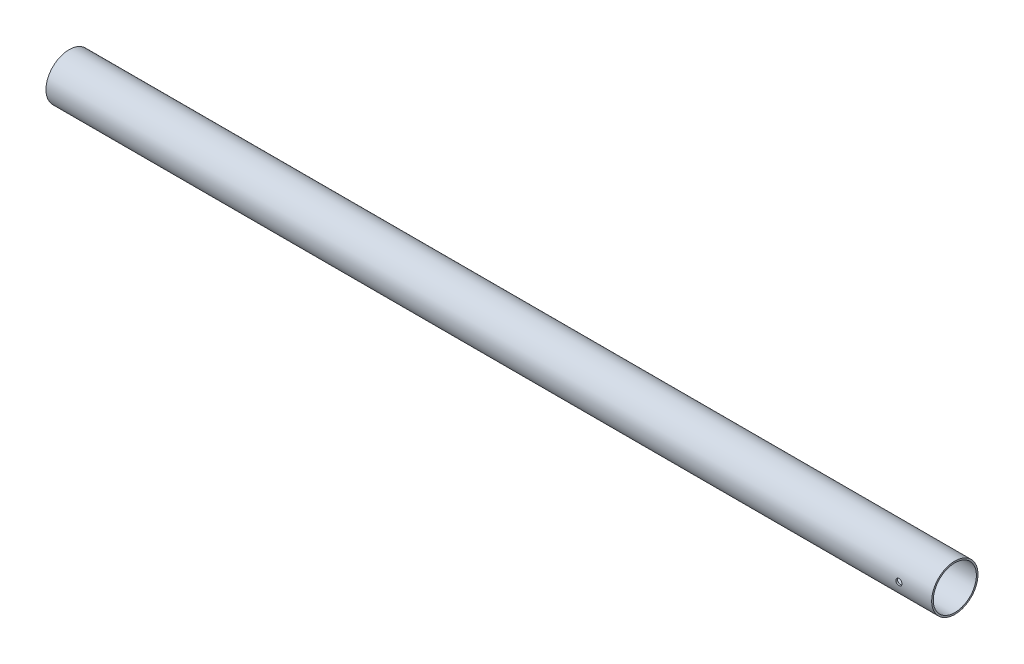
ISO-10303-21;
HEADER;
FILE_DESCRIPTION(('STEP AP214'),'2;1');
FILE_NAME('part.step','',(''),(''),'','','');
FILE_SCHEMA(('AUTOMOTIVE_DESIGN { 1 0 10303 214 1 1 1 1 }'));
ENDSEC;
DATA;
#1=APPLICATION_CONTEXT('core data for automotive mechanical design processes');
#2=APPLICATION_PROTOCOL_DEFINITION('international standard','automotive_design',2000,#1);
#3=PRODUCT_CONTEXT('',#1,'mechanical');
#4=PRODUCT('Part','Part','',(#3));
#5=PRODUCT_RELATED_PRODUCT_CATEGORY('part','',(#4));
#6=PRODUCT_DEFINITION_FORMATION('','',#4);
#7=PRODUCT_DEFINITION_CONTEXT('part definition',#1,'design');
#8=PRODUCT_DEFINITION('design','',#6,#7);
#9=PRODUCT_DEFINITION_SHAPE('','',#8);
#10=(LENGTH_UNIT() NAMED_UNIT(*) SI_UNIT(.MILLI.,.METRE.));
#11=(NAMED_UNIT(*) PLANE_ANGLE_UNIT() SI_UNIT($,.RADIAN.));
#12=(NAMED_UNIT(*) SI_UNIT($,.STERADIAN.) SOLID_ANGLE_UNIT());
#13=UNCERTAINTY_MEASURE_WITH_UNIT(LENGTH_MEASURE(1.E-05),#10,'distance_accuracy_value','');
#14=(GEOMETRIC_REPRESENTATION_CONTEXT(3) GLOBAL_UNCERTAINTY_ASSIGNED_CONTEXT((#13)) GLOBAL_UNIT_ASSIGNED_CONTEXT((#10,
#11,#12)) REPRESENTATION_CONTEXT('',''));
#15=CARTESIAN_POINT('',(0.,0.,0.));
#16=DIRECTION('',(0.,0.,1.));
#17=DIRECTION('',(1.,0.,0.));
#18=AXIS2_PLACEMENT_3D('',#15,#16,#17);
#19=CARTESIAN_POINT('',(485.9,0.,0.));
#20=DIRECTION('',(1.,0.,0.));
#21=DIRECTION('',(0.,0.,-1.));
#22=AXIS2_PLACEMENT_3D('',#19,#20,#21);
#23=PLANE('',#22);
#24=CARTESIAN_POINT('',(485.9,0.,0.));
#25=DIRECTION('',(1.,0.,0.));
#26=DIRECTION('',(0.,0.,-1.));
#27=AXIS2_PLACEMENT_3D('',#24,#25,#26);
#28=CIRCLE('',#27,12.7);
#29=CARTESIAN_POINT('',(485.9,0.,-12.7));
#30=VERTEX_POINT('',#29);
#31=EDGE_CURVE('E10',#30,#30,#28,.T.);
#32=ORIENTED_EDGE('',*,*,#31,.T.);
#33=EDGE_LOOP('',(#32));
#34=FACE_BOUND('',#33,.T.);
#35=CARTESIAN_POINT('',(485.9,0.,0.));
#36=DIRECTION('',(1.,0.,0.));
#37=DIRECTION('',(0.,0.,-1.));
#38=AXIS2_PLACEMENT_3D('',#35,#36,#37);
#39=CIRCLE('',#38,11.811);
#40=CARTESIAN_POINT('',(485.9,0.,-11.811));
#41=VERTEX_POINT('',#40);
#42=EDGE_CURVE('E56',#41,#41,#39,.T.);
#43=ORIENTED_EDGE('',*,*,#42,.F.);
#44=EDGE_LOOP('',(#43));
#45=FACE_BOUND('',#44,.T.);
#46=ADVANCED_FACE('F37',(#34,#45),#23,.T.);
#47=CARTESIAN_POINT('',(0.,0.,0.));
#48=DIRECTION('',(1.,0.,0.));
#49=DIRECTION('',(0.,0.,-1.));
#50=AXIS2_PLACEMENT_3D('',#47,#48,#49);
#51=PLANE('',#50);
#52=CARTESIAN_POINT('',(0.,0.,0.));
#53=DIRECTION('',(1.,0.,0.));
#54=DIRECTION('',(0.,0.,-1.));
#55=AXIS2_PLACEMENT_3D('',#52,#53,#54);
#56=CIRCLE('',#55,12.7);
#57=CARTESIAN_POINT('',(0.,0.,-12.7));
#58=VERTEX_POINT('',#57);
#59=EDGE_CURVE('E51',#58,#58,#56,.T.);
#60=ORIENTED_EDGE('',*,*,#59,.F.);
#61=EDGE_LOOP('',(#60));
#62=FACE_BOUND('',#61,.T.);
#63=CARTESIAN_POINT('',(0.,0.,0.));
#64=DIRECTION('',(1.,0.,0.));
#65=DIRECTION('',(0.,0.,-1.));
#66=AXIS2_PLACEMENT_3D('',#63,#64,#65);
#67=CIRCLE('',#66,11.811);
#68=CARTESIAN_POINT('',(0.,0.,-11.811));
#69=VERTEX_POINT('',#68);
#70=EDGE_CURVE('E59',#69,#69,#67,.T.);
#71=ORIENTED_EDGE('',*,*,#70,.T.);
#72=EDGE_LOOP('',(#71));
#73=FACE_BOUND('',#72,.T.);
#74=ADVANCED_FACE('F95',(#62,#73),#51,.F.);
#75=CARTESIAN_POINT('',(485.9,0.,0.));
#76=DIRECTION('',(-1.,0.,0.));
#77=DIRECTION('',(0.,0.,1.));
#78=AXIS2_PLACEMENT_3D('',#75,#76,#77);
#79=CYLINDRICAL_SURFACE('',#78,12.7);
#80=CARTESIAN_POINT('',(469.6,0.,-12.7));
#81=CARTESIAN_POINT('',(469.599995999218,0.0950339668840688,-12.6999985995786));
#82=CARTESIAN_POINT('',(469.592004188255,0.190125906931177,-12.69892205577));
#83=CARTESIAN_POINT('',(469.560251692804,0.37765973551567,-12.6947310786922));
#84=CARTESIAN_POINT('',(469.536474913755,0.470098818704444,-12.6916145654891));
#85=CARTESIAN_POINT('',(469.473868960347,0.649585162895946,-12.6836944529743));
#86=CARTESIAN_POINT('',(469.435050336211,0.736636153540434,-12.6788920363625));
#87=CARTESIAN_POINT('',(469.343486628217,0.902972809326968,-12.668133083874));
#88=CARTESIAN_POINT('',(469.290743780409,0.982259718480784,-12.6621767333452));
#89=CARTESIAN_POINT('',(469.172475253805,1.1313307462382,-12.6497322350832));
#90=CARTESIAN_POINT('',(469.106879547119,1.20105907920497,-12.6432412923369));
#91=CARTESIAN_POINT('',(468.964917838176,1.32855287527096,-12.6304814917944));
#92=CARTESIAN_POINT('',(468.888551264791,1.38631770360165,-12.6242126457971));
#93=CARTESIAN_POINT('',(468.726848730155,1.48845585085958,-12.6125794864754));
#94=CARTESIAN_POINT('',(468.641479096526,1.53277630674077,-12.6072187794791));
#95=CARTESIAN_POINT('',(468.464424454548,1.60642994888795,-12.5980462279763));
#96=CARTESIAN_POINT('',(468.372739720477,1.6357637855904,-12.5942343162519));
#97=CARTESIAN_POINT('',(468.186239299322,1.67844067068206,-12.5886179602665));
#98=CARTESIAN_POINT('',(468.09144564102,1.69187839487357,-12.5868016351371));
#99=CARTESIAN_POINT('',(467.900932673288,1.70267468090191,-12.5853458584028));
#100=CARTESIAN_POINT('',(467.805213406573,1.70003398123823,-12.5857063068164));
#101=CARTESIAN_POINT('',(467.616229133458,1.67882597900673,-12.5885524791077));
#102=CARTESIAN_POINT('',(467.522952140251,1.66036334859316,-12.591024234991));
#103=CARTESIAN_POINT('',(467.340832208731,1.60819906549931,-12.5977927233188));
#104=CARTESIAN_POINT('',(467.2519893723,1.57449706285328,-12.6020894976741));
#105=CARTESIAN_POINT('',(467.080936742358,1.49269942688406,-12.6120395901206));
#106=CARTESIAN_POINT('',(466.99874877275,1.44455869286374,-12.6176971476118));
#107=CARTESIAN_POINT('',(466.843578171045,1.33528234667652,-12.6297281429156));
#108=CARTESIAN_POINT('',(466.77059602167,1.27414605351565,-12.6361016182354));
#109=CARTESIAN_POINT('',(466.635301502768,1.14003577368444,-12.6489082931571));
#110=CARTESIAN_POINT('',(466.573078463414,1.06697163981452,-12.655341565124));
#111=CARTESIAN_POINT('',(466.46176529398,0.911389033566204,-12.6674957373912));
#112=CARTESIAN_POINT('',(466.412675202254,0.828870533577802,-12.6732166356108));
#113=CARTESIAN_POINT('',(466.329019845054,0.65664985246887,-12.6833057832175));
#114=CARTESIAN_POINT('',(466.294460606196,0.566944709042,-12.6876734711684));
#115=CARTESIAN_POINT('',(466.240921123221,0.382932939657356,-12.6945591425037));
#116=CARTESIAN_POINT('',(466.221940041968,0.288626561248737,-12.6970772252812));
#117=CARTESIAN_POINT('',(466.200212458823,0.0988612499416624,-12.6999669678248));
#118=CARTESIAN_POINT('',(466.197342983486,0.00341663518549185,-12.7003548857848));
#119=CARTESIAN_POINT('',(466.207594909204,-0.186592199942914,-12.6989846078418));
#120=CARTESIAN_POINT('',(466.220715918464,-0.281156441828672,-12.6972264645213));
#121=CARTESIAN_POINT('',(466.262474156656,-0.466354124240498,-12.6917717046385));
#122=CARTESIAN_POINT('',(466.291052322894,-0.557001118115935,-12.688082468612));
#123=CARTESIAN_POINT('',(466.362851947505,-0.732216342306022,-12.6791782889493));
#124=CARTESIAN_POINT('',(466.406073968547,-0.816784338893341,-12.6739632866891));
#125=CARTESIAN_POINT('',(466.506228893795,-0.977987387725025,-12.6625478144558));
#126=CARTESIAN_POINT('',(466.563240832125,-1.05457293223037,-12.6563417366426));
#127=CARTESIAN_POINT('',(466.689246019563,-1.19713236803616,-12.6436547701942));
#128=CARTESIAN_POINT('',(466.758239817077,-1.26310577335475,-12.6371738689908));
#129=CARTESIAN_POINT('',(466.906793907203,-1.38300824178855,-12.6246170593813));
#130=CARTESIAN_POINT('',(466.986420532293,-1.43685547455966,-12.6185440858799));
#131=CARTESIAN_POINT('',(467.153660180856,-1.53041060066334,-12.607540272347));
#132=CARTESIAN_POINT('',(467.241273024771,-1.57011881179428,-12.6026094066456));
#133=CARTESIAN_POINT('',(467.421740778158,-1.63413811770881,-12.5944685488549));
#134=CARTESIAN_POINT('',(467.514579449597,-1.65849431867462,-12.5912535197242));
#135=CARTESIAN_POINT('',(467.703075101137,-1.69126295280575,-12.5868942723901));
#136=CARTESIAN_POINT('',(467.798731928919,-1.69967624606924,-12.5857499424755));
#137=CARTESIAN_POINT('',(467.989333986317,-1.7003028934154,-12.5856652315807));
#138=CARTESIAN_POINT('',(468.084278810843,-1.69264483293009,-12.5867073569543));
#139=CARTESIAN_POINT('',(468.271518383431,-1.66161953930398,-12.5908403897388));
#140=CARTESIAN_POINT('',(468.363813132574,-1.63825231257077,-12.593931296314));
#141=CARTESIAN_POINT('',(468.543109423105,-1.57651400196729,-12.601807977421));
#142=CARTESIAN_POINT('',(468.630113460132,-1.53815005652326,-12.6065929454788));
#143=CARTESIAN_POINT('',(468.796470248896,-1.44751995832387,-12.6173198076024));
#144=CARTESIAN_POINT('',(468.875822849499,-1.39525353103897,-12.6232617245136));
#145=CARTESIAN_POINT('',(469.025280326848,-1.2778282054891,-12.6356898389152));
#146=CARTESIAN_POINT('',(469.09530972473,-1.21257363471887,-12.6421798563099));
#147=CARTESIAN_POINT('',(469.223472129704,-1.07122538659933,-12.6549397826002));
#148=CARTESIAN_POINT('',(469.281602343048,-0.995129170891928,-12.6612096395197));
#149=CARTESIAN_POINT('',(469.38453599194,-0.833873629090056,-12.6728533752327));
#150=CARTESIAN_POINT('',(469.429280296286,-0.748676282109249,-12.6782232337741));
#151=CARTESIAN_POINT('',(469.503760889228,-0.571949691102314,-12.6874217828558));
#152=CARTESIAN_POINT('',(469.53351323197,-0.480427340192078,-12.6912521210983));
#153=CARTESIAN_POINT('',(469.570166857384,-0.323709683642177,-12.6960329483211));
#154=CARTESIAN_POINT('',(469.581337872477,-0.259496143043083,-12.6975132154494));
#155=CARTESIAN_POINT('',(469.59625578124,-0.130197467849983,-12.6994972166818));
#156=CARTESIAN_POINT('',(469.600002741128,-0.0651123410352923,-12.700000959496));
#157=CARTESIAN_POINT('',(469.6,0.,-12.7));
#158=B_SPLINE_CURVE_WITH_KNOTS('',3,(#80,#81,#82,#83,#84,#85,#86,#87,#88,#89,#90,#91,#92,#93,
#94,#95,#96,#97,#98,#99,#100,#101,#102,#103,#104,#105,#106,#107,#108,#109,#110,#111,#112,#113,
#114,#115,#116,#117,#118,#119,#120,#121,#122,#123,#124,#125,#126,#127,#128,#129,#130,#131,#132,
#133,#134,#135,#136,#137,#138,#139,#140,#141,#142,#143,#144,#145,#146,#147,#148,#149,#150,#151,
#152,#153,#154,#155,#156,#157),.UNSPECIFIED.,.T.,.F.,(4,2,2,2,2,2,2,2,2,2,2,2,2,2,2,2,2,2,2,2,2,
2,2,2,2,2,2,2,2,2,2,2,2,2,2,2,2,2,4),(0.,0.284864035698544,0.570018969485689,0.85497425898077,
1.13988381611718,1.42639115813431,1.71291369797889,2.00054865692532,2.28817113112362,
2.5740717861256,2.85995930949884,3.14396997780507,3.42798716862776,3.7129009196287,
3.9978296043771,4.28502088941331,4.57221301316843,4.85952413156247,5.14681980945717,
5.43191966224496,5.71701252971182,6.00102365831215,6.28504570083366,6.57073582475001,
6.8564390280947,7.14401601038434,7.43158652848794,7.71830813986003,8.00501428255082,
8.28943526420124,8.57385612983961,8.85814177590322,9.14243303611564,9.42890156631928,
9.71543727805722,10.0032206578248,10.2906952062609,10.4858709975235,10.6810450479104),.UNSPECIFIED.);
#159=CARTESIAN_POINT('',(469.6,0.,-12.7));
#160=VERTEX_POINT('',#159);
#161=EDGE_CURVE('E84',#160,#160,#158,.T.);
#162=ORIENTED_EDGE('',*,*,#161,.T.);
#163=EDGE_LOOP('',(#162));
#164=FACE_BOUND('',#163,.T.);
#165=CARTESIAN_POINT('',(469.6,0.,12.7));
#166=CARTESIAN_POINT('',(469.599995999218,-0.0950339668840688,12.6999985995786));
#167=CARTESIAN_POINT('',(469.592004188255,-0.190125906931177,12.69892205577));
#168=CARTESIAN_POINT('',(469.560251692804,-0.37765973551567,12.6947310786922));
#169=CARTESIAN_POINT('',(469.536474913755,-0.470098818704444,12.6916145654891));
#170=CARTESIAN_POINT('',(469.473868960347,-0.649585162895946,12.6836944529743));
#171=CARTESIAN_POINT('',(469.435050336211,-0.736636153540434,12.6788920363625));
#172=CARTESIAN_POINT('',(469.343486628217,-0.902972809326968,12.668133083874));
#173=CARTESIAN_POINT('',(469.290743780409,-0.982259718480784,12.6621767333452));
#174=CARTESIAN_POINT('',(469.172475253805,-1.1313307462382,12.6497322350832));
#175=CARTESIAN_POINT('',(469.106879547119,-1.20105907920497,12.6432412923369));
#176=CARTESIAN_POINT('',(468.964917838176,-1.32855287527096,12.6304814917944));
#177=CARTESIAN_POINT('',(468.888551264791,-1.38631770360165,12.6242126457971));
#178=CARTESIAN_POINT('',(468.726848730155,-1.48845585085958,12.6125794864754));
#179=CARTESIAN_POINT('',(468.641479096526,-1.53277630674077,12.6072187794791));
#180=CARTESIAN_POINT('',(468.464424454548,-1.60642994888795,12.5980462279763));
#181=CARTESIAN_POINT('',(468.372739720477,-1.6357637855904,12.5942343162519));
#182=CARTESIAN_POINT('',(468.186239299322,-1.67844067068206,12.5886179602665));
#183=CARTESIAN_POINT('',(468.09144564102,-1.69187839487357,12.5868016351371));
#184=CARTESIAN_POINT('',(467.900932673288,-1.70267468090191,12.5853458584028));
#185=CARTESIAN_POINT('',(467.805213406573,-1.70003398123823,12.5857063068164));
#186=CARTESIAN_POINT('',(467.616229133458,-1.67882597900673,12.5885524791077));
#187=CARTESIAN_POINT('',(467.522952140251,-1.66036334859316,12.591024234991));
#188=CARTESIAN_POINT('',(467.340832208731,-1.60819906549931,12.5977927233188));
#189=CARTESIAN_POINT('',(467.2519893723,-1.57449706285328,12.6020894976741));
#190=CARTESIAN_POINT('',(467.080936742358,-1.49269942688406,12.6120395901206));
#191=CARTESIAN_POINT('',(466.99874877275,-1.44455869286374,12.6176971476118));
#192=CARTESIAN_POINT('',(466.843578171045,-1.33528234667652,12.6297281429156));
#193=CARTESIAN_POINT('',(466.77059602167,-1.27414605351565,12.6361016182354));
#194=CARTESIAN_POINT('',(466.635301502768,-1.14003577368444,12.6489082931571));
#195=CARTESIAN_POINT('',(466.573078463414,-1.06697163981452,12.655341565124));
#196=CARTESIAN_POINT('',(466.46176529398,-0.911389033566204,12.6674957373912));
#197=CARTESIAN_POINT('',(466.412675202254,-0.828870533577802,12.6732166356108));
#198=CARTESIAN_POINT('',(466.329019845054,-0.65664985246887,12.6833057832175));
#199=CARTESIAN_POINT('',(466.294460606196,-0.566944709042,12.6876734711684));
#200=CARTESIAN_POINT('',(466.240921123221,-0.382932939657356,12.6945591425037));
#201=CARTESIAN_POINT('',(466.221940041968,-0.288626561248737,12.6970772252812));
#202=CARTESIAN_POINT('',(466.200212458823,-0.0988612499416624,12.6999669678248));
#203=CARTESIAN_POINT('',(466.197342983486,-0.00341663518549185,12.7003548857848));
#204=CARTESIAN_POINT('',(466.207594909204,0.186592199942914,12.6989846078418));
#205=CARTESIAN_POINT('',(466.220715918464,0.281156441828672,12.6972264645213));
#206=CARTESIAN_POINT('',(466.262474156656,0.466354124240498,12.6917717046385));
#207=CARTESIAN_POINT('',(466.291052322894,0.557001118115935,12.688082468612));
#208=CARTESIAN_POINT('',(466.362851947505,0.732216342306022,12.6791782889493));
#209=CARTESIAN_POINT('',(466.406073968547,0.816784338893341,12.6739632866891));
#210=CARTESIAN_POINT('',(466.506228893795,0.977987387725025,12.6625478144558));
#211=CARTESIAN_POINT('',(466.563240832125,1.05457293223037,12.6563417366426));
#212=CARTESIAN_POINT('',(466.689246019563,1.19713236803616,12.6436547701942));
#213=CARTESIAN_POINT('',(466.758239817077,1.26310577335475,12.6371738689908));
#214=CARTESIAN_POINT('',(466.906793907203,1.38300824178855,12.6246170593813));
#215=CARTESIAN_POINT('',(466.986420532293,1.43685547455966,12.6185440858799));
#216=CARTESIAN_POINT('',(467.153660180856,1.53041060066334,12.607540272347));
#217=CARTESIAN_POINT('',(467.241273024771,1.57011881179428,12.6026094066456));
#218=CARTESIAN_POINT('',(467.421740778158,1.63413811770881,12.5944685488549));
#219=CARTESIAN_POINT('',(467.514579449597,1.65849431867462,12.5912535197242));
#220=CARTESIAN_POINT('',(467.703075101137,1.69126295280575,12.5868942723901));
#221=CARTESIAN_POINT('',(467.798731928919,1.69967624606924,12.5857499424755));
#222=CARTESIAN_POINT('',(467.989333986317,1.7003028934154,12.5856652315807));
#223=CARTESIAN_POINT('',(468.084278810843,1.69264483293009,12.5867073569543));
#224=CARTESIAN_POINT('',(468.271518383431,1.66161953930398,12.5908403897388));
#225=CARTESIAN_POINT('',(468.363813132574,1.63825231257077,12.593931296314));
#226=CARTESIAN_POINT('',(468.543109423105,1.57651400196729,12.601807977421));
#227=CARTESIAN_POINT('',(468.630113460132,1.53815005652326,12.6065929454788));
#228=CARTESIAN_POINT('',(468.796470248896,1.44751995832387,12.6173198076024));
#229=CARTESIAN_POINT('',(468.875822849499,1.39525353103897,12.6232617245136));
#230=CARTESIAN_POINT('',(469.025280326848,1.2778282054891,12.6356898389152));
#231=CARTESIAN_POINT('',(469.09530972473,1.21257363471887,12.6421798563099));
#232=CARTESIAN_POINT('',(469.223472129704,1.07122538659933,12.6549397826002));
#233=CARTESIAN_POINT('',(469.281602343048,0.995129170891928,12.6612096395197));
#234=CARTESIAN_POINT('',(469.38453599194,0.833873629090056,12.6728533752327));
#235=CARTESIAN_POINT('',(469.429280296286,0.748676282109249,12.6782232337741));
#236=CARTESIAN_POINT('',(469.503760889228,0.571949691102314,12.6874217828558));
#237=CARTESIAN_POINT('',(469.53351323197,0.480427340192078,12.6912521210983));
#238=CARTESIAN_POINT('',(469.570166857384,0.323709683642177,12.6960329483211));
#239=CARTESIAN_POINT('',(469.581337872477,0.259496143043083,12.6975132154494));
#240=CARTESIAN_POINT('',(469.59625578124,0.130197467849983,12.6994972166818));
#241=CARTESIAN_POINT('',(469.600002741128,0.0651123410352923,12.700000959496));
#242=CARTESIAN_POINT('',(469.6,0.,12.7));
#243=B_SPLINE_CURVE_WITH_KNOTS('',3,(#165,#166,#167,#168,#169,#170,#171,#172,#173,#174,#175,
#176,#177,#178,#179,#180,#181,#182,#183,#184,#185,#186,#187,#188,#189,#190,#191,#192,#193,#194,
#195,#196,#197,#198,#199,#200,#201,#202,#203,#204,#205,#206,#207,#208,#209,#210,#211,#212,#213,
#214,#215,#216,#217,#218,#219,#220,#221,#222,#223,#224,#225,#226,#227,#228,#229,#230,#231,#232,
#233,#234,#235,#236,#237,#238,#239,#240,#241,#242),.UNSPECIFIED.,.T.,.F.,(4,2,2,2,2,2,2,2,2,2,2,
2,2,2,2,2,2,2,2,2,2,2,2,2,2,2,2,2,2,2,2,2,2,2,2,2,2,2,4),(0.,0.284864035698544,
0.570018969485689,0.85497425898077,1.13988381611718,1.42639115813431,1.71291369797889,
2.00054865692532,2.28817113112362,2.5740717861256,2.85995930949884,3.14396997780507,
3.42798716862776,3.7129009196287,3.9978296043771,4.28502088941331,4.57221301316843,
4.85952413156247,5.14681980945717,5.43191966224496,5.71701252971182,6.00102365831215,
6.28504570083366,6.57073582475001,6.8564390280947,7.14401601038434,7.43158652848794,
7.71830813986003,8.00501428255082,8.28943526420124,8.57385612983961,8.85814177590322,
9.14243303611564,9.42890156631928,9.71543727805722,10.0032206578248,10.2906952062609,
10.4858709975235,10.6810450479104),.UNSPECIFIED.);
#244=CARTESIAN_POINT('',(469.6,0.,12.7));
#245=VERTEX_POINT('',#244);
#246=EDGE_CURVE('E79',#245,#245,#243,.T.);
#247=ORIENTED_EDGE('',*,*,#246,.T.);
#248=EDGE_LOOP('',(#247));
#249=FACE_BOUND('',#248,.T.);
#250=ORIENTED_EDGE('',*,*,#31,.F.);
#251=EDGE_LOOP('',(#250));
#252=FACE_BOUND('',#251,.T.);
#253=ORIENTED_EDGE('',*,*,#59,.T.);
#254=EDGE_LOOP('',(#253));
#255=FACE_BOUND('',#254,.T.);
#256=ADVANCED_FACE('F39',(#164,#249,#252,#255),#79,.T.);
#257=CARTESIAN_POINT('',(485.9,0.,0.));
#258=DIRECTION('',(-1.,0.,0.));
#259=DIRECTION('',(0.,0.,1.));
#260=AXIS2_PLACEMENT_3D('',#257,#258,#259);
#261=CYLINDRICAL_SURFACE('',#260,11.811);
#262=CARTESIAN_POINT('',(469.6,0.,11.811));
#263=CARTESIAN_POINT('',(469.599996050682,-0.0949633365740567,11.8109985219341));
#264=CARTESIAN_POINT('',(469.592016055247,-0.189982877219706,11.8098426802892));
#265=CARTESIAN_POINT('',(469.560313249563,-0.377369093460645,11.8053430227354));
#266=CARTESIAN_POINT('',(469.536574823049,-0.469733042599291,11.8019970364864));
#267=CARTESIAN_POINT('',(469.474076563351,-0.649068854077997,11.7934933444568));
#268=CARTESIAN_POINT('',(469.435327764051,-0.736044622835732,11.7883369697238));
#269=CARTESIAN_POINT('',(469.34393495919,-0.902245224987221,11.7767832373071));
#270=CARTESIAN_POINT('',(469.291293000088,-0.981471197569829,11.7703860624296));
#271=CARTESIAN_POINT('',(469.173203095912,-1.13050913396133,11.7570112315331));
#272=CARTESIAN_POINT('',(469.107674732601,-1.2002570730976,11.7500300971524));
#273=CARTESIAN_POINT('',(468.965845122036,-1.32780690367163,11.7363015989273));
#274=CARTESIAN_POINT('',(468.889543274701,-1.38560812923761,11.7295542481307));
#275=CARTESIAN_POINT('',(468.727905899503,-1.48787036847237,11.7170234438705));
#276=CARTESIAN_POINT('',(468.642531108502,-1.53226992046286,11.7112444838184));
#277=CARTESIAN_POINT('',(468.465439193357,-1.60607577266454,11.7013519190154));
#278=CARTESIAN_POINT('',(468.373722387587,-1.63548282488967,11.6972382307377));
#279=CARTESIAN_POINT('',(468.187221238183,-1.67827112473673,11.6911759676832));
#280=CARTESIAN_POINT('',(468.092462449863,-1.69176163203232,11.6892126384495));
#281=CARTESIAN_POINT('',(467.902007249026,-1.70267227309993,11.6876285186793));
#282=CARTESIAN_POINT('',(467.806310886409,-1.70009325756096,11.6880076041401));
#283=CARTESIAN_POINT('',(467.617466121485,-1.67902745255734,11.691051985365));
#284=CARTESIAN_POINT('',(467.524303862142,-1.66066200271546,11.693699842128));
#285=CARTESIAN_POINT('',(467.342397203228,-1.60873443984949,11.7009561911545));
#286=CARTESIAN_POINT('',(467.253652919602,-1.57517192822509,11.7055647348442));
#287=CARTESIAN_POINT('',(467.082730143395,-1.49367567025864,11.716242590323));
#288=CARTESIAN_POINT('',(467.000576661492,-1.44569018392093,11.7223171454555));
#289=CARTESIAN_POINT('',(466.845441933238,-1.33674699740005,11.7352387233349));
#290=CARTESIAN_POINT('',(466.772461242225,-1.27578851240672,11.7420857928038));
#291=CARTESIAN_POINT('',(466.637040231638,-1.14196200077648,11.7558580883074));
#292=CARTESIAN_POINT('',(466.574703044655,-1.06898958032783,11.7627834539105));
#293=CARTESIAN_POINT('',(466.463144921449,-0.913563355066765,11.7758734292219));
#294=CARTESIAN_POINT('',(466.413924034736,-0.831109514466236,11.7820380360584));
#295=CARTESIAN_POINT('',(466.329991769931,-0.65897417201428,11.7929176287989));
#296=CARTESIAN_POINT('',(466.295287960213,-0.569288929110813,11.7976318582212));
#297=CARTESIAN_POINT('',(466.241462597583,-0.385280648300705,11.8050730910877));
#298=CARTESIAN_POINT('',(466.222340075453,-0.290957899252351,11.8078002181366));
#299=CARTESIAN_POINT('',(466.200356344637,-0.101242607019824,11.8109436834614));
#300=CARTESIAN_POINT('',(466.19735327718,-0.00586682355210564,11.811380179601));
#301=CARTESIAN_POINT('',(466.207317726359,0.184026880290379,11.8099479582115));
#302=CARTESIAN_POINT('',(466.220284788843,0.278544824983117,11.8080793062356));
#303=CARTESIAN_POINT('',(466.261703471076,0.463613016155278,11.8022592312506));
#304=CARTESIAN_POINT('',(466.290086358521,0.554178960795702,11.7983170556067));
#305=CARTESIAN_POINT('',(466.361458788845,0.729266418257611,11.7887906933605));
#306=CARTESIAN_POINT('',(466.404448970063,0.813787666730865,11.7832064350008));
#307=CARTESIAN_POINT('',(466.504151152314,0.975012812185228,11.7709668100829));
#308=CARTESIAN_POINT('',(466.560953601429,1.05166023789249,11.7643044843033));
#309=CARTESIAN_POINT('',(466.686541458759,1.19438484899553,11.750672986933));
#310=CARTESIAN_POINT('',(466.75532750546,1.26046147081891,11.7437037990075));
#311=CARTESIAN_POINT('',(466.903559830618,1.38068166669792,11.7301805683755));
#312=CARTESIAN_POINT('',(466.983083390951,1.4347304137384,11.7236300961746));
#313=CARTESIAN_POINT('',(467.150163724419,1.52870253161707,11.7117480571151));
#314=CARTESIAN_POINT('',(467.23772029423,1.5686262598515,11.7064164594173));
#315=CARTESIAN_POINT('',(467.418092483132,1.63306637135508,11.6976013208194));
#316=CARTESIAN_POINT('',(467.510889635267,1.65763357539349,11.6941116901567));
#317=CARTESIAN_POINT('',(467.699346436716,1.69082554924416,11.6893590853919));
#318=CARTESIAN_POINT('',(467.795005904926,1.69945132554608,11.6880959707151));
#319=CARTESIAN_POINT('',(467.985527255397,1.70049305790301,11.6879443741982));
#320=CARTESIAN_POINT('',(468.080388339111,1.69305807386294,11.6890340560121));
#321=CARTESIAN_POINT('',(468.267496457398,1.66250778747193,11.6934179490026));
#322=CARTESIAN_POINT('',(468.359743494878,1.63939250255818,11.6967121577278));
#323=CARTESIAN_POINT('',(468.538969227933,1.57818894246531,11.7051265233326));
#324=CARTESIAN_POINT('',(468.625951256865,1.54011025772635,11.7102455104686));
#325=CARTESIAN_POINT('',(468.792315980106,1.45007554750402,11.7217341938223));
#326=CARTESIAN_POINT('',(468.871698458375,1.39811912766292,11.7281039255805));
#327=CARTESIAN_POINT('',(469.021369336934,1.28125914108147,11.7414469050402));
#328=CARTESIAN_POINT('',(469.091570949977,1.21624496153648,11.7484249990409));
#329=CARTESIAN_POINT('',(469.220121621648,1.07534846350217,11.7621573750622));
#330=CARTESIAN_POINT('',(469.278467912711,0.999463614343961,11.7689116045155));
#331=CARTESIAN_POINT('',(469.381912273538,0.838531339138109,11.7814739265501));
#332=CARTESIAN_POINT('',(469.426941964951,0.753439585305882,11.787277069854));
#333=CARTESIAN_POINT('',(469.502004253317,0.576859476383469,11.7972345527272));
#334=CARTESIAN_POINT('',(469.532052581816,0.485377946647688,11.801390620903));
#335=CARTESIAN_POINT('',(469.569384211429,0.327890845246779,11.8066231007302));
#336=CARTESIAN_POINT('',(469.580847861636,0.262863239839537,11.8082561218876));
#337=CARTESIAN_POINT('',(469.596157085684,0.131899455682019,11.8104450789484));
#338=CARTESIAN_POINT('',(469.600002743269,0.0659632869274217,11.8110010266919));
#339=CARTESIAN_POINT('',(469.6,0.,11.811));
#340=B_SPLINE_CURVE_WITH_KNOTS('',3,(#262,#263,#264,#265,#266,#267,#268,#269,#270,#271,#272,
#273,#274,#275,#276,#277,#278,#279,#280,#281,#282,#283,#284,#285,#286,#287,#288,#289,#290,#291,
#292,#293,#294,#295,#296,#297,#298,#299,#300,#301,#302,#303,#304,#305,#306,#307,#308,#309,#310,
#311,#312,#313,#314,#315,#316,#317,#318,#319,#320,#321,#322,#323,#324,#325,#326,#327,#328,#329,
#330,#331,#332,#333,#334,#335,#336,#337,#338,#339),.UNSPECIFIED.,.T.,.F.,(4,2,2,2,2,2,2,2,2,2,2,
2,2,2,2,2,2,2,2,2,2,2,2,2,2,2,2,2,2,2,2,2,2,2,2,2,2,2,4),(0.,0.28464899775675,0.56958049847307,
0.854302946868711,1.13898347911695,1.42550042768719,1.71203334149628,1.99986103307518,
2.28767428598523,2.57350012218827,2.85931082746098,3.14294414558128,3.42658490348701,
3.71125557174501,3.99594346624173,4.28325010816804,4.57055783458398,4.85801516070146,
5.14545460447155,5.43036024797859,5.71525778960851,5.99889540411344,6.28254541515715,
6.56810541339525,6.85368063092422,7.14143326657696,7.42917862088985,7.71596659993669,
8.00273647150888,8.28685627476273,8.57097576206346,8.85491344587567,9.13885919908386,
9.42532023099901,9.71184805913813,9.99982258064406,10.2874940671829,10.4852186901636,
10.6829411395848),.UNSPECIFIED.);
#341=CARTESIAN_POINT('',(469.6,0.,11.811));
#342=VERTEX_POINT('',#341);
#343=EDGE_CURVE('E42',#342,#342,#340,.T.);
#344=ORIENTED_EDGE('',*,*,#343,.F.);
#345=EDGE_LOOP('',(#344));
#346=FACE_BOUND('',#345,.T.);
#347=CARTESIAN_POINT('',(469.6,0.,-11.811));
#348=CARTESIAN_POINT('',(469.599996050682,0.0949633365740567,-11.8109985219341));
#349=CARTESIAN_POINT('',(469.592016055247,0.189982877219706,-11.8098426802892));
#350=CARTESIAN_POINT('',(469.560313249563,0.377369093460645,-11.8053430227354));
#351=CARTESIAN_POINT('',(469.536574823049,0.469733042599291,-11.8019970364864));
#352=CARTESIAN_POINT('',(469.474076563351,0.649068854077997,-11.7934933444568));
#353=CARTESIAN_POINT('',(469.435327764051,0.736044622835732,-11.7883369697238));
#354=CARTESIAN_POINT('',(469.34393495919,0.902245224987221,-11.7767832373071));
#355=CARTESIAN_POINT('',(469.291293000088,0.981471197569829,-11.7703860624296));
#356=CARTESIAN_POINT('',(469.173203095912,1.13050913396133,-11.7570112315331));
#357=CARTESIAN_POINT('',(469.107674732601,1.2002570730976,-11.7500300971524));
#358=CARTESIAN_POINT('',(468.965845122036,1.32780690367163,-11.7363015989273));
#359=CARTESIAN_POINT('',(468.889543274701,1.38560812923761,-11.7295542481307));
#360=CARTESIAN_POINT('',(468.727905899503,1.48787036847237,-11.7170234438705));
#361=CARTESIAN_POINT('',(468.642531108502,1.53226992046286,-11.7112444838184));
#362=CARTESIAN_POINT('',(468.465439193357,1.60607577266454,-11.7013519190154));
#363=CARTESIAN_POINT('',(468.373722387587,1.63548282488967,-11.6972382307377));
#364=CARTESIAN_POINT('',(468.187221238183,1.67827112473673,-11.6911759676832));
#365=CARTESIAN_POINT('',(468.092462449863,1.69176163203232,-11.6892126384495));
#366=CARTESIAN_POINT('',(467.902007249026,1.70267227309993,-11.6876285186793));
#367=CARTESIAN_POINT('',(467.806310886409,1.70009325756096,-11.6880076041401));
#368=CARTESIAN_POINT('',(467.617466121485,1.67902745255734,-11.691051985365));
#369=CARTESIAN_POINT('',(467.524303862142,1.66066200271546,-11.693699842128));
#370=CARTESIAN_POINT('',(467.342397203228,1.60873443984949,-11.7009561911545));
#371=CARTESIAN_POINT('',(467.253652919602,1.57517192822509,-11.7055647348442));
#372=CARTESIAN_POINT('',(467.082730143395,1.49367567025864,-11.716242590323));
#373=CARTESIAN_POINT('',(467.000576661492,1.44569018392093,-11.7223171454555));
#374=CARTESIAN_POINT('',(466.845441933238,1.33674699740005,-11.7352387233349));
#375=CARTESIAN_POINT('',(466.772461242225,1.27578851240672,-11.7420857928038));
#376=CARTESIAN_POINT('',(466.637040231638,1.14196200077648,-11.7558580883074));
#377=CARTESIAN_POINT('',(466.574703044655,1.06898958032783,-11.7627834539105));
#378=CARTESIAN_POINT('',(466.463144921449,0.913563355066765,-11.7758734292219));
#379=CARTESIAN_POINT('',(466.413924034736,0.831109514466236,-11.7820380360584));
#380=CARTESIAN_POINT('',(466.329991769931,0.65897417201428,-11.7929176287989));
#381=CARTESIAN_POINT('',(466.295287960213,0.569288929110813,-11.7976318582212));
#382=CARTESIAN_POINT('',(466.241462597583,0.385280648300705,-11.8050730910877));
#383=CARTESIAN_POINT('',(466.222340075453,0.290957899252351,-11.8078002181366));
#384=CARTESIAN_POINT('',(466.200356344637,0.101242607019824,-11.8109436834614));
#385=CARTESIAN_POINT('',(466.19735327718,0.00586682355210564,-11.811380179601));
#386=CARTESIAN_POINT('',(466.207317726359,-0.184026880290379,-11.8099479582115));
#387=CARTESIAN_POINT('',(466.220284788843,-0.278544824983117,-11.8080793062356));
#388=CARTESIAN_POINT('',(466.261703471076,-0.463613016155278,-11.8022592312506));
#389=CARTESIAN_POINT('',(466.290086358521,-0.554178960795702,-11.7983170556067));
#390=CARTESIAN_POINT('',(466.361458788845,-0.729266418257611,-11.7887906933605));
#391=CARTESIAN_POINT('',(466.404448970063,-0.813787666730865,-11.7832064350008));
#392=CARTESIAN_POINT('',(466.504151152314,-0.975012812185228,-11.7709668100829));
#393=CARTESIAN_POINT('',(466.560953601429,-1.05166023789249,-11.7643044843033));
#394=CARTESIAN_POINT('',(466.686541458759,-1.19438484899553,-11.750672986933));
#395=CARTESIAN_POINT('',(466.75532750546,-1.26046147081891,-11.7437037990075));
#396=CARTESIAN_POINT('',(466.903559830618,-1.38068166669792,-11.7301805683755));
#397=CARTESIAN_POINT('',(466.983083390951,-1.4347304137384,-11.7236300961746));
#398=CARTESIAN_POINT('',(467.150163724419,-1.52870253161707,-11.7117480571151));
#399=CARTESIAN_POINT('',(467.23772029423,-1.5686262598515,-11.7064164594173));
#400=CARTESIAN_POINT('',(467.418092483132,-1.63306637135508,-11.6976013208194));
#401=CARTESIAN_POINT('',(467.510889635267,-1.65763357539349,-11.6941116901567));
#402=CARTESIAN_POINT('',(467.699346436716,-1.69082554924416,-11.6893590853919));
#403=CARTESIAN_POINT('',(467.795005904926,-1.69945132554608,-11.6880959707151));
#404=CARTESIAN_POINT('',(467.985527255397,-1.70049305790301,-11.6879443741982));
#405=CARTESIAN_POINT('',(468.080388339111,-1.69305807386294,-11.6890340560121));
#406=CARTESIAN_POINT('',(468.267496457398,-1.66250778747193,-11.6934179490026));
#407=CARTESIAN_POINT('',(468.359743494878,-1.63939250255818,-11.6967121577278));
#408=CARTESIAN_POINT('',(468.538969227933,-1.57818894246531,-11.7051265233326));
#409=CARTESIAN_POINT('',(468.625951256865,-1.54011025772635,-11.7102455104686));
#410=CARTESIAN_POINT('',(468.792315980106,-1.45007554750402,-11.7217341938223));
#411=CARTESIAN_POINT('',(468.871698458375,-1.39811912766292,-11.7281039255805));
#412=CARTESIAN_POINT('',(469.021369336934,-1.28125914108147,-11.7414469050402));
#413=CARTESIAN_POINT('',(469.091570949977,-1.21624496153648,-11.7484249990409));
#414=CARTESIAN_POINT('',(469.220121621648,-1.07534846350217,-11.7621573750622));
#415=CARTESIAN_POINT('',(469.278467912711,-0.999463614343961,-11.7689116045155));
#416=CARTESIAN_POINT('',(469.381912273538,-0.838531339138109,-11.7814739265501));
#417=CARTESIAN_POINT('',(469.426941964951,-0.753439585305882,-11.787277069854));
#418=CARTESIAN_POINT('',(469.502004253317,-0.576859476383469,-11.7972345527272));
#419=CARTESIAN_POINT('',(469.532052581816,-0.485377946647688,-11.801390620903));
#420=CARTESIAN_POINT('',(469.569384211429,-0.327890845246779,-11.8066231007302));
#421=CARTESIAN_POINT('',(469.580847861636,-0.262863239839537,-11.8082561218876));
#422=CARTESIAN_POINT('',(469.596157085684,-0.131899455682019,-11.8104450789484));
#423=CARTESIAN_POINT('',(469.600002743269,-0.0659632869274217,-11.8110010266919));
#424=CARTESIAN_POINT('',(469.6,0.,-11.811));
#425=B_SPLINE_CURVE_WITH_KNOTS('',3,(#347,#348,#349,#350,#351,#352,#353,#354,#355,#356,#357,
#358,#359,#360,#361,#362,#363,#364,#365,#366,#367,#368,#369,#370,#371,#372,#373,#374,#375,#376,
#377,#378,#379,#380,#381,#382,#383,#384,#385,#386,#387,#388,#389,#390,#391,#392,#393,#394,#395,
#396,#397,#398,#399,#400,#401,#402,#403,#404,#405,#406,#407,#408,#409,#410,#411,#412,#413,#414,
#415,#416,#417,#418,#419,#420,#421,#422,#423,#424),.UNSPECIFIED.,.T.,.F.,(4,2,2,2,2,2,2,2,2,2,2,
2,2,2,2,2,2,2,2,2,2,2,2,2,2,2,2,2,2,2,2,2,2,2,2,2,2,2,4),(0.,0.28464899775675,0.56958049847307,
0.854302946868711,1.13898347911695,1.42550042768719,1.71203334149628,1.99986103307518,
2.28767428598523,2.57350012218827,2.85931082746098,3.14294414558128,3.42658490348701,
3.71125557174501,3.99594346624173,4.28325010816804,4.57055783458398,4.85801516070146,
5.14545460447155,5.43036024797859,5.71525778960851,5.99889540411344,6.28254541515715,
6.56810541339525,6.85368063092422,7.14143326657696,7.42917862088985,7.71596659993669,
8.00273647150888,8.28685627476273,8.57097576206346,8.85491344587567,9.13885919908386,
9.42532023099901,9.71184805913813,9.99982258064406,10.2874940671829,10.4852186901636,
10.6829411395848),.UNSPECIFIED.);
#426=CARTESIAN_POINT('',(469.6,0.,-11.811));
#427=VERTEX_POINT('',#426);
#428=EDGE_CURVE('E61',#427,#427,#425,.T.);
#429=ORIENTED_EDGE('',*,*,#428,.F.);
#430=EDGE_LOOP('',(#429));
#431=FACE_BOUND('',#430,.T.);
#432=ORIENTED_EDGE('',*,*,#42,.T.);
#433=EDGE_LOOP('',(#432));
#434=FACE_BOUND('',#433,.T.);
#435=ORIENTED_EDGE('',*,*,#70,.F.);
#436=EDGE_LOOP('',(#435));
#437=FACE_BOUND('',#436,.T.);
#438=ADVANCED_FACE('F66',(#346,#431,#434,#437),#261,.F.);
#439=CARTESIAN_POINT('',(467.9,0.,-12.7));
#440=DIRECTION('',(0.,0.,1.));
#441=DIRECTION('',(1.,0.,0.));
#442=AXIS2_PLACEMENT_3D('',#439,#440,#441);
#443=CYLINDRICAL_SURFACE('',#442,1.69999999999998);
#444=ORIENTED_EDGE('',*,*,#428,.T.);
#445=EDGE_LOOP('',(#444));
#446=FACE_BOUND('',#445,.T.);
#447=ORIENTED_EDGE('',*,*,#161,.F.);
#448=EDGE_LOOP('',(#447));
#449=FACE_BOUND('',#448,.T.);
#450=ADVANCED_FACE('F69',(#446,#449),#443,.F.);
#451=ORIENTED_EDGE('',*,*,#343,.T.);
#452=EDGE_LOOP('',(#451));
#453=FACE_BOUND('',#452,.T.);
#454=ORIENTED_EDGE('',*,*,#246,.F.);
#455=EDGE_LOOP('',(#454));
#456=FACE_BOUND('',#455,.T.);
#457=ADVANCED_FACE('F72',(#453,#456),#443,.F.);
#458=CLOSED_SHELL('',(#46,#74,#256,#438,#450,#457));
#459=MANIFOLD_SOLID_BREP('B2',#458);
#460=ADVANCED_BREP_SHAPE_REPRESENTATION('',(#18,#459),#14);
#461=SHAPE_DEFINITION_REPRESENTATION(#9,#460);
ENDSEC;
END-ISO-10303-21;
